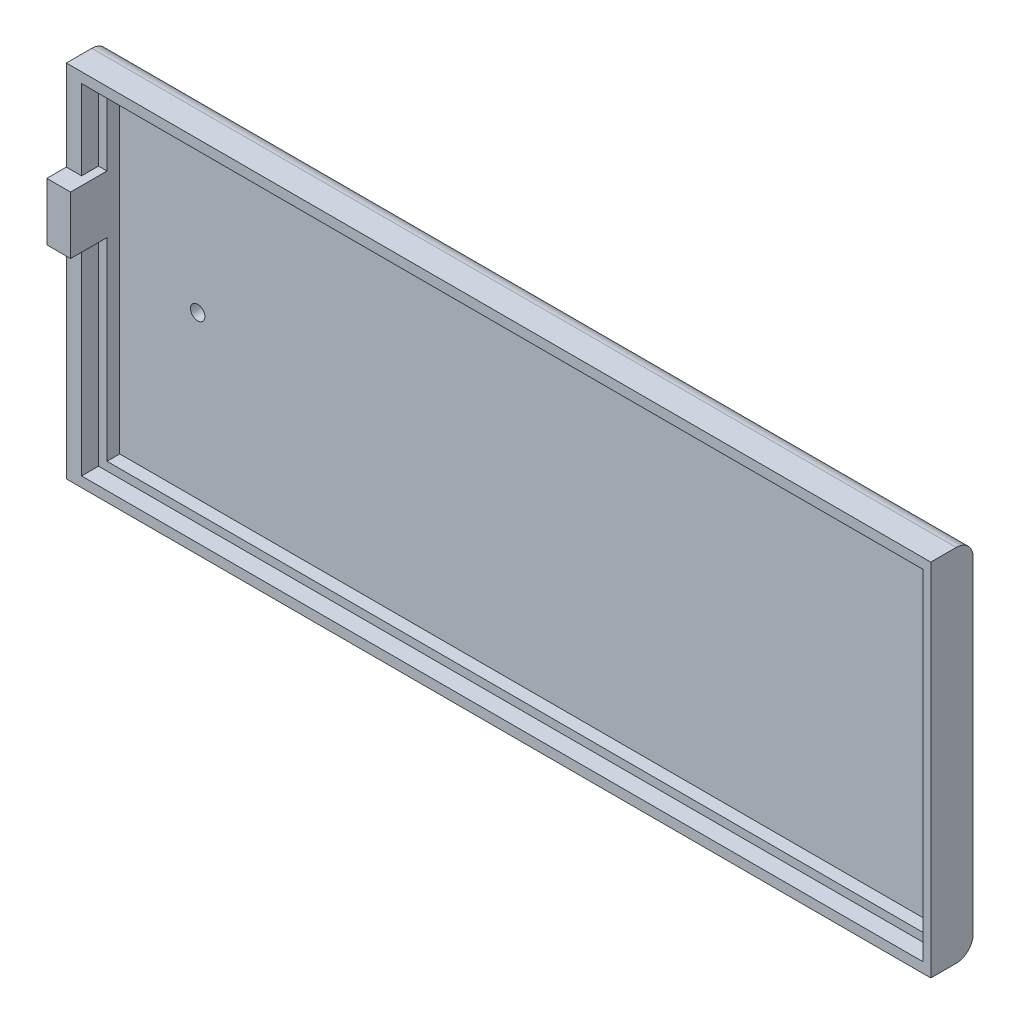
ISO-10303-21;
HEADER;
FILE_DESCRIPTION(('STEP AP214'),'2;1');
FILE_NAME('part.step','',(''),(''),'','','');
FILE_SCHEMA(('AUTOMOTIVE_DESIGN { 1 0 10303 214 1 1 1 1 }'));
ENDSEC;
DATA;
#1=APPLICATION_CONTEXT('core data for automotive mechanical design processes');
#2=APPLICATION_PROTOCOL_DEFINITION('international standard','automotive_design',2000,#1);
#3=PRODUCT_CONTEXT('',#1,'mechanical');
#4=PRODUCT('Part','Part','',(#3));
#5=PRODUCT_RELATED_PRODUCT_CATEGORY('part','',(#4));
#6=PRODUCT_DEFINITION_FORMATION('','',#4);
#7=PRODUCT_DEFINITION_CONTEXT('part definition',#1,'design');
#8=PRODUCT_DEFINITION('design','',#6,#7);
#9=PRODUCT_DEFINITION_SHAPE('','',#8);
#10=(LENGTH_UNIT() NAMED_UNIT(*) SI_UNIT(.MILLI.,.METRE.));
#11=(NAMED_UNIT(*) PLANE_ANGLE_UNIT() SI_UNIT($,.RADIAN.));
#12=(NAMED_UNIT(*) SI_UNIT($,.STERADIAN.) SOLID_ANGLE_UNIT());
#13=UNCERTAINTY_MEASURE_WITH_UNIT(LENGTH_MEASURE(1.E-05),#10,'distance_accuracy_value','');
#14=(GEOMETRIC_REPRESENTATION_CONTEXT(3) GLOBAL_UNCERTAINTY_ASSIGNED_CONTEXT((#13)) GLOBAL_UNIT_ASSIGNED_CONTEXT((#10,
#11,#12)) REPRESENTATION_CONTEXT('',''));
#15=CARTESIAN_POINT('',(0.,0.,0.));
#16=DIRECTION('',(0.,0.,1.));
#17=DIRECTION('',(1.,0.,0.));
#18=AXIS2_PLACEMENT_3D('',#15,#16,#17);
#19=CARTESIAN_POINT('',(0.,0.,5.));
#20=DIRECTION('',(0.,0.,-1.));
#21=DIRECTION('',(-1.,0.,0.));
#22=AXIS2_PLACEMENT_3D('',#19,#20,#21);
#23=PLANE('',#22);
#24=DIRECTION('',(-1.,0.,0.));
#25=VECTOR('',#24,1.);
#26=CARTESIAN_POINT('',(0.,31.8635072,5.));
#27=LINE('',#26,#25);
#28=CARTESIAN_POINT('',(1.8,31.8635072,5.));
#29=VERTEX_POINT('',#28);
#30=CARTESIAN_POINT('',(0.,31.8635072,5.));
#31=VERTEX_POINT('',#30);
#32=EDGE_CURVE('E424',#29,#31,#27,.T.);
#33=ORIENTED_EDGE('',*,*,#32,.F.);
#34=DIRECTION('',(0.,-1.,0.));
#35=VECTOR('',#34,1.);
#36=CARTESIAN_POINT('',(1.8,31.8635072,5.));
#37=LINE('',#36,#35);
#38=CARTESIAN_POINT('',(1.8,41.3,5.));
#39=VERTEX_POINT('',#38);
#40=EDGE_CURVE('E197',#39,#29,#37,.T.);
#41=ORIENTED_EDGE('',*,*,#40,.F.);
#42=DIRECTION('',(-1.,0.,0.));
#43=VECTOR('',#42,1.);
#44=CARTESIAN_POINT('',(1.8,41.3,5.));
#45=LINE('',#44,#43);
#46=CARTESIAN_POINT('',(101.1,41.3,5.));
#47=VERTEX_POINT('',#46);
#48=EDGE_CURVE('E397',#47,#39,#45,.T.);
#49=ORIENTED_EDGE('',*,*,#48,.F.);
#50=DIRECTION('',(0.,1.,0.));
#51=VECTOR('',#50,1.);
#52=CARTESIAN_POINT('',(101.1,41.3,5.));
#53=LINE('',#52,#51);
#54=CARTESIAN_POINT('',(101.1,1.2,5.));
#55=VERTEX_POINT('',#54);
#56=EDGE_CURVE('E393',#55,#47,#53,.T.);
#57=ORIENTED_EDGE('',*,*,#56,.F.);
#58=DIRECTION('',(1.,0.,0.));
#59=VECTOR('',#58,1.);
#60=CARTESIAN_POINT('',(101.1,1.2,5.));
#61=LINE('',#60,#59);
#62=CARTESIAN_POINT('',(1.80000000000001,1.19999999999999,5.));
#63=VERTEX_POINT('',#62);
#64=EDGE_CURVE('E388',#63,#55,#61,.T.);
#65=ORIENTED_EDGE('',*,*,#64,.F.);
#66=DIRECTION('',(0.,-1.,0.));
#67=VECTOR('',#66,1.);
#68=CARTESIAN_POINT('',(1.80000000000001,1.19999999999999,5.));
#69=LINE('',#68,#67);
#70=CARTESIAN_POINT('',(1.8,25.0635072,5.));
#71=VERTEX_POINT('',#70);
#72=EDGE_CURVE('E384',#71,#63,#69,.T.);
#73=ORIENTED_EDGE('',*,*,#72,.F.);
#74=DIRECTION('',(1.,0.,0.));
#75=VECTOR('',#74,1.);
#76=CARTESIAN_POINT('',(0.,25.0635072,5.));
#77=LINE('',#76,#75);
#78=CARTESIAN_POINT('',(0.,25.0635072,5.));
#79=VERTEX_POINT('',#78);
#80=EDGE_CURVE('E311',#79,#71,#77,.T.);
#81=ORIENTED_EDGE('',*,*,#80,.F.);
#82=DIRECTION('',(0.,-1.,0.));
#83=VECTOR('',#82,1.);
#84=CARTESIAN_POINT('',(0.,0.,5.));
#85=LINE('',#84,#83);
#86=CARTESIAN_POINT('',(0.,0.,5.));
#87=VERTEX_POINT('',#86);
#88=EDGE_CURVE('E238',#79,#87,#85,.T.);
#89=ORIENTED_EDGE('',*,*,#88,.T.);
#90=DIRECTION('',(1.,0.,0.));
#91=VECTOR('',#90,1.);
#92=CARTESIAN_POINT('',(0.,0.,5.));
#93=LINE('',#92,#91);
#94=CARTESIAN_POINT('',(102.,0.,5.));
#95=VERTEX_POINT('',#94);
#96=EDGE_CURVE('E237',#87,#95,#93,.T.);
#97=ORIENTED_EDGE('',*,*,#96,.T.);
#98=DIRECTION('',(0.,1.,0.));
#99=VECTOR('',#98,1.);
#100=CARTESIAN_POINT('',(102.,0.,5.));
#101=LINE('',#100,#99);
#102=CARTESIAN_POINT('',(102.,42.5,5.));
#103=VERTEX_POINT('',#102);
#104=EDGE_CURVE('E241',#95,#103,#101,.T.);
#105=ORIENTED_EDGE('',*,*,#104,.T.);
#106=DIRECTION('',(-1.,0.,0.));
#107=VECTOR('',#106,1.);
#108=CARTESIAN_POINT('',(0.,42.5,5.));
#109=LINE('',#108,#107);
#110=CARTESIAN_POINT('',(0.,42.5,5.));
#111=VERTEX_POINT('',#110);
#112=EDGE_CURVE('E244',#103,#111,#109,.T.);
#113=ORIENTED_EDGE('',*,*,#112,.T.);
#114=EDGE_CURVE('E233',#111,#31,#85,.T.);
#115=ORIENTED_EDGE('',*,*,#114,.T.);
#116=EDGE_LOOP('',(#33,#41,#49,#57,#65,#73,#81,#89,#97,#105,#113,#115));
#117=FACE_BOUND('',#116,.T.);
#118=ADVANCED_FACE('F45',(#117),#23,.F.);
#119=CARTESIAN_POINT('',(0.,0.,5.));
#120=DIRECTION('',(1.,0.,0.));
#121=DIRECTION('',(0.,0.,-1.));
#122=AXIS2_PLACEMENT_3D('',#119,#120,#121);
#123=PLANE('',#122);
#124=DIRECTION('',(0.,-1.,0.));
#125=VECTOR('',#124,1.);
#126=CARTESIAN_POINT('',(0.,0.,0.));
#127=LINE('',#126,#125);
#128=CARTESIAN_POINT('',(0.,40.5,0.));
#129=VERTEX_POINT('',#128);
#130=CARTESIAN_POINT('',(0.,2.,0.));
#131=VERTEX_POINT('',#130);
#132=EDGE_CURVE('E214',#129,#131,#127,.T.);
#133=ORIENTED_EDGE('',*,*,#132,.T.);
#134=CARTESIAN_POINT('',(0.,2.,2.));
#135=DIRECTION('',(1.,0.,0.));
#136=DIRECTION('',(0.,0.,-1.));
#137=AXIS2_PLACEMENT_3D('',#134,#135,#136);
#138=CIRCLE('',#137,2.);
#139=CARTESIAN_POINT('',(0.,0.,2.));
#140=VERTEX_POINT('',#139);
#141=EDGE_CURVE('E54',#131,#140,#138,.F.);
#142=ORIENTED_EDGE('',*,*,#141,.T.);
#143=DIRECTION('',(0.,0.,-1.));
#144=VECTOR('',#143,1.);
#145=CARTESIAN_POINT('',(0.,0.,5.));
#146=LINE('',#145,#144);
#147=EDGE_CURVE('E262',#87,#140,#146,.T.);
#148=ORIENTED_EDGE('',*,*,#147,.F.);
#149=ORIENTED_EDGE('',*,*,#88,.F.);
#150=DIRECTION('',(0.,0.,-1.));
#151=VECTOR('',#150,1.);
#152=CARTESIAN_POINT('',(0.,25.0635072,7.3));
#153=LINE('',#152,#151);
#154=CARTESIAN_POINT('',(0.,25.0635072,7.3));
#155=VERTEX_POINT('',#154);
#156=EDGE_CURVE('E316',#155,#79,#153,.T.);
#157=ORIENTED_EDGE('',*,*,#156,.F.);
#158=DIRECTION('',(0.,-1.,0.));
#159=VECTOR('',#158,1.);
#160=CARTESIAN_POINT('',(0.,31.8635072,7.3));
#161=LINE('',#160,#159);
#162=CARTESIAN_POINT('',(0.,31.8635072,7.3));
#163=VERTEX_POINT('',#162);
#164=EDGE_CURVE('E421',#163,#155,#161,.T.);
#165=ORIENTED_EDGE('',*,*,#164,.F.);
#166=DIRECTION('',(0.,0.,-1.));
#167=VECTOR('',#166,1.);
#168=CARTESIAN_POINT('',(0.,31.8635072,7.3));
#169=LINE('',#168,#167);
#170=EDGE_CURVE('E433',#163,#31,#169,.T.);
#171=ORIENTED_EDGE('',*,*,#170,.T.);
#172=ORIENTED_EDGE('',*,*,#114,.F.);
#173=DIRECTION('',(0.,0.,-1.));
#174=VECTOR('',#173,1.);
#175=CARTESIAN_POINT('',(0.,42.5,5.));
#176=LINE('',#175,#174);
#177=CARTESIAN_POINT('',(0.,42.5,2.));
#178=VERTEX_POINT('',#177);
#179=EDGE_CURVE('E246',#111,#178,#176,.T.);
#180=ORIENTED_EDGE('',*,*,#179,.T.);
#181=CARTESIAN_POINT('',(0.,40.5,2.));
#182=DIRECTION('',(1.,0.,0.));
#183=DIRECTION('',(0.,0.,-1.));
#184=AXIS2_PLACEMENT_3D('',#181,#182,#183);
#185=CIRCLE('',#184,2.);
#186=EDGE_CURVE('E61',#178,#129,#185,.F.);
#187=ORIENTED_EDGE('',*,*,#186,.T.);
#188=EDGE_LOOP('',(#133,#142,#148,#149,#157,#165,#171,#172,#180,#187));
#189=FACE_BOUND('',#188,.T.);
#190=ADVANCED_FACE('F286',(#189),#123,.F.);
#191=CARTESIAN_POINT('',(0.,0.,5.));
#192=DIRECTION('',(0.,1.,0.));
#193=DIRECTION('',(0.,0.,1.));
#194=AXIS2_PLACEMENT_3D('',#191,#192,#193);
#195=PLANE('',#194);
#196=ORIENTED_EDGE('',*,*,#147,.T.);
#197=DIRECTION('',(1.,0.,0.));
#198=VECTOR('',#197,1.);
#199=CARTESIAN_POINT('',(102.,0.,2.));
#200=LINE('',#199,#198);
#201=CARTESIAN_POINT('',(102.,0.,2.));
#202=VERTEX_POINT('',#201);
#203=EDGE_CURVE('E266',#140,#202,#200,.T.);
#204=ORIENTED_EDGE('',*,*,#203,.T.);
#205=DIRECTION('',(0.,0.,-1.));
#206=VECTOR('',#205,1.);
#207=CARTESIAN_POINT('',(102.,0.,5.));
#208=LINE('',#207,#206);
#209=EDGE_CURVE('E258',#95,#202,#208,.T.);
#210=ORIENTED_EDGE('',*,*,#209,.F.);
#211=ORIENTED_EDGE('',*,*,#96,.F.);
#212=EDGE_LOOP('',(#196,#204,#210,#211));
#213=FACE_BOUND('',#212,.T.);
#214=ADVANCED_FACE('F292',(#213),#195,.F.);
#215=CARTESIAN_POINT('',(102.,0.,5.));
#216=DIRECTION('',(-1.,0.,0.));
#217=DIRECTION('',(0.,0.,1.));
#218=AXIS2_PLACEMENT_3D('',#215,#216,#217);
#219=PLANE('',#218);
#220=ORIENTED_EDGE('',*,*,#209,.T.);
#221=CARTESIAN_POINT('',(102.,2.,2.));
#222=DIRECTION('',(-1.,0.,0.));
#223=DIRECTION('',(0.,0.,1.));
#224=AXIS2_PLACEMENT_3D('',#221,#222,#223);
#225=CIRCLE('',#224,2.);
#226=CARTESIAN_POINT('',(102.,2.,0.));
#227=VERTEX_POINT('',#226);
#228=EDGE_CURVE('E273',#202,#227,#225,.F.);
#229=ORIENTED_EDGE('',*,*,#228,.T.);
#230=DIRECTION('',(0.,1.,0.));
#231=VECTOR('',#230,1.);
#232=CARTESIAN_POINT('',(102.,0.,0.));
#233=LINE('',#232,#231);
#234=CARTESIAN_POINT('',(102.,40.5,0.));
#235=VERTEX_POINT('',#234);
#236=EDGE_CURVE('E218',#227,#235,#233,.T.);
#237=ORIENTED_EDGE('',*,*,#236,.T.);
#238=CARTESIAN_POINT('',(102.,40.5,2.));
#239=DIRECTION('',(-1.,0.,0.));
#240=DIRECTION('',(0.,0.,1.));
#241=AXIS2_PLACEMENT_3D('',#238,#239,#240);
#242=CIRCLE('',#241,2.);
#243=CARTESIAN_POINT('',(102.,42.5,2.));
#244=VERTEX_POINT('',#243);
#245=EDGE_CURVE('E270',#235,#244,#242,.F.);
#246=ORIENTED_EDGE('',*,*,#245,.T.);
#247=DIRECTION('',(0.,0.,-1.));
#248=VECTOR('',#247,1.);
#249=CARTESIAN_POINT('',(102.,42.5,5.));
#250=LINE('',#249,#248);
#251=EDGE_CURVE('E254',#103,#244,#250,.T.);
#252=ORIENTED_EDGE('',*,*,#251,.F.);
#253=ORIENTED_EDGE('',*,*,#104,.F.);
#254=EDGE_LOOP('',(#220,#229,#237,#246,#252,#253));
#255=FACE_BOUND('',#254,.T.);
#256=ADVANCED_FACE('F296',(#255),#219,.F.);
#257=CARTESIAN_POINT('',(0.,42.5,5.));
#258=DIRECTION('',(0.,-1.,0.));
#259=DIRECTION('',(0.,0.,-1.));
#260=AXIS2_PLACEMENT_3D('',#257,#258,#259);
#261=PLANE('',#260);
#262=ORIENTED_EDGE('',*,*,#251,.T.);
#263=DIRECTION('',(-1.,0.,0.));
#264=VECTOR('',#263,1.);
#265=CARTESIAN_POINT('',(0.,42.5,2.));
#266=LINE('',#265,#264);
#267=EDGE_CURVE('E11',#244,#178,#266,.T.);
#268=ORIENTED_EDGE('',*,*,#267,.T.);
#269=ORIENTED_EDGE('',*,*,#179,.F.);
#270=ORIENTED_EDGE('',*,*,#112,.F.);
#271=EDGE_LOOP('',(#262,#268,#269,#270));
#272=FACE_BOUND('',#271,.T.);
#273=ADVANCED_FACE('F303',(#272),#261,.F.);
#274=CARTESIAN_POINT('',(0.,0.,0.));
#275=DIRECTION('',(0.,0.,-1.));
#276=DIRECTION('',(-1.,0.,0.));
#277=AXIS2_PLACEMENT_3D('',#274,#275,#276);
#278=PLANE('',#277);
#279=CARTESIAN_POINT('',(12.,21.25,0.));
#280=DIRECTION('',(0.,0.,-1.));
#281=DIRECTION('',(-1.,0.,0.));
#282=AXIS2_PLACEMENT_3D('',#279,#280,#281);
#283=CIRCLE('',#282,0.85);
#284=CARTESIAN_POINT('',(11.15,21.25,0.));
#285=VERTEX_POINT('',#284);
#286=EDGE_CURVE('E389',#285,#285,#283,.T.);
#287=ORIENTED_EDGE('',*,*,#286,.F.);
#288=EDGE_LOOP('',(#287));
#289=FACE_BOUND('',#288,.T.);
#290=ORIENTED_EDGE('',*,*,#236,.F.);
#291=DIRECTION('',(1.,0.,0.));
#292=VECTOR('',#291,1.);
#293=CARTESIAN_POINT('',(0.,2.,0.));
#294=LINE('',#293,#292);
#295=EDGE_CURVE('E68',#227,#131,#294,.F.);
#296=ORIENTED_EDGE('',*,*,#295,.T.);
#297=ORIENTED_EDGE('',*,*,#132,.F.);
#298=DIRECTION('',(-1.,0.,0.));
#299=VECTOR('',#298,1.);
#300=CARTESIAN_POINT('',(102.,40.5,0.));
#301=LINE('',#300,#299);
#302=EDGE_CURVE('E276',#129,#235,#301,.F.);
#303=ORIENTED_EDGE('',*,*,#302,.T.);
#304=EDGE_LOOP('',(#290,#296,#297,#303));
#305=FACE_BOUND('',#304,.T.);
#306=ADVANCED_FACE('F299',(#289,#305),#278,.T.);
#307=CARTESIAN_POINT('',(2.8,40.3,1.5));
#308=DIRECTION('',(-1.,0.,0.));
#309=DIRECTION('',(0.,-1.,0.));
#310=AXIS2_PLACEMENT_3D('',#307,#308,#309);
#311=PLANE('',#310);
#312=DIRECTION('',(0.,1.,0.));
#313=VECTOR('',#312,1.);
#314=CARTESIAN_POINT('',(2.8,40.3,3.));
#315=LINE('',#314,#313);
#316=CARTESIAN_POINT('',(2.8,31.8635072,3.));
#317=VERTEX_POINT('',#316);
#318=CARTESIAN_POINT('',(2.8,40.3,3.));
#319=VERTEX_POINT('',#318);
#320=EDGE_CURVE('E185',#317,#319,#315,.T.);
#321=ORIENTED_EDGE('',*,*,#320,.F.);
#322=DIRECTION('',(0.,0.,-1.));
#323=VECTOR('',#322,1.);
#324=CARTESIAN_POINT('',(2.8,31.8635072,7.3));
#325=LINE('',#324,#323);
#326=CARTESIAN_POINT('',(2.8,31.8635072,7.3));
#327=VERTEX_POINT('',#326);
#328=EDGE_CURVE('E329',#327,#317,#325,.T.);
#329=ORIENTED_EDGE('',*,*,#328,.F.);
#330=DIRECTION('',(0.,1.,0.));
#331=VECTOR('',#330,1.);
#332=CARTESIAN_POINT('',(2.8,31.8635072,7.3));
#333=LINE('',#332,#331);
#334=CARTESIAN_POINT('',(2.8,25.0635072,7.3));
#335=VERTEX_POINT('',#334);
#336=EDGE_CURVE('E427',#335,#327,#333,.T.);
#337=ORIENTED_EDGE('',*,*,#336,.F.);
#338=DIRECTION('',(0.,0.,-1.));
#339=VECTOR('',#338,1.);
#340=CARTESIAN_POINT('',(2.8,25.0635072,7.3));
#341=LINE('',#340,#339);
#342=CARTESIAN_POINT('',(2.8,25.0635072,3.));
#343=VERTEX_POINT('',#342);
#344=EDGE_CURVE('E323',#335,#343,#341,.T.);
#345=ORIENTED_EDGE('',*,*,#344,.T.);
#346=DIRECTION('',(0.,1.,0.));
#347=VECTOR('',#346,1.);
#348=CARTESIAN_POINT('',(2.8,25.0635072,3.));
#349=LINE('',#348,#347);
#350=CARTESIAN_POINT('',(2.80000000000001,2.2,3.));
#351=VERTEX_POINT('',#350);
#352=EDGE_CURVE('E352',#351,#343,#349,.T.);
#353=ORIENTED_EDGE('',*,*,#352,.F.);
#354=DIRECTION('',(0.,0.,1.));
#355=VECTOR('',#354,1.);
#356=CARTESIAN_POINT('',(2.80000000000001,2.2,1.5));
#357=LINE('',#356,#355);
#358=CARTESIAN_POINT('',(2.80000000000001,2.2,1.5));
#359=VERTEX_POINT('',#358);
#360=EDGE_CURVE('E229',#359,#351,#357,.T.);
#361=ORIENTED_EDGE('',*,*,#360,.F.);
#362=DIRECTION('',(0.,-1.,0.));
#363=VECTOR('',#362,1.);
#364=CARTESIAN_POINT('',(2.8,40.3,1.5));
#365=LINE('',#364,#363);
#366=CARTESIAN_POINT('',(2.8,40.3,1.5));
#367=VERTEX_POINT('',#366);
#368=EDGE_CURVE('E211',#367,#359,#365,.T.);
#369=ORIENTED_EDGE('',*,*,#368,.F.);
#370=DIRECTION('',(0.,0.,1.));
#371=VECTOR('',#370,1.);
#372=CARTESIAN_POINT('',(2.8,40.3,1.5));
#373=LINE('',#372,#371);
#374=EDGE_CURVE('E203',#367,#319,#373,.T.);
#375=ORIENTED_EDGE('',*,*,#374,.T.);
#376=EDGE_LOOP('',(#321,#329,#337,#345,#353,#361,#369,#375));
#377=FACE_BOUND('',#376,.T.);
#378=ADVANCED_FACE('F209',(#377),#311,.F.);
#379=CARTESIAN_POINT('',(2.8,40.3,1.5));
#380=DIRECTION('',(0.,1.,0.));
#381=DIRECTION('',(0.,0.,1.));
#382=AXIS2_PLACEMENT_3D('',#379,#380,#381);
#383=PLANE('',#382);
#384=DIRECTION('',(0.,0.,1.));
#385=VECTOR('',#384,1.);
#386=CARTESIAN_POINT('',(100.1,40.3,1.5));
#387=LINE('',#386,#385);
#388=CARTESIAN_POINT('',(100.1,40.3,1.5));
#389=VERTEX_POINT('',#388);
#390=CARTESIAN_POINT('',(100.1,40.3,3.));
#391=VERTEX_POINT('',#390);
#392=EDGE_CURVE('E205',#389,#391,#387,.T.);
#393=ORIENTED_EDGE('',*,*,#392,.T.);
#394=DIRECTION('',(1.,0.,0.));
#395=VECTOR('',#394,1.);
#396=CARTESIAN_POINT('',(100.1,40.3,3.));
#397=LINE('',#396,#395);
#398=EDGE_CURVE('E188',#319,#391,#397,.T.);
#399=ORIENTED_EDGE('',*,*,#398,.F.);
#400=ORIENTED_EDGE('',*,*,#374,.F.);
#401=DIRECTION('',(-1.,0.,0.));
#402=VECTOR('',#401,1.);
#403=CARTESIAN_POINT('',(2.8,40.3,1.5));
#404=LINE('',#403,#402);
#405=EDGE_CURVE('E223',#389,#367,#404,.T.);
#406=ORIENTED_EDGE('',*,*,#405,.F.);
#407=EDGE_LOOP('',(#393,#399,#400,#406));
#408=FACE_BOUND('',#407,.T.);
#409=ADVANCED_FACE('F201',(#408),#383,.F.);
#410=CARTESIAN_POINT('',(100.1,40.3,1.5));
#411=DIRECTION('',(1.,0.,0.));
#412=DIRECTION('',(0.,0.,-1.));
#413=AXIS2_PLACEMENT_3D('',#410,#411,#412);
#414=PLANE('',#413);
#415=DIRECTION('',(0.,0.,1.));
#416=VECTOR('',#415,1.);
#417=CARTESIAN_POINT('',(100.1,2.2,1.5));
#418=LINE('',#417,#416);
#419=CARTESIAN_POINT('',(100.1,2.2,1.5));
#420=VERTEX_POINT('',#419);
#421=CARTESIAN_POINT('',(100.1,2.2,3.));
#422=VERTEX_POINT('',#421);
#423=EDGE_CURVE('E220',#420,#422,#418,.T.);
#424=ORIENTED_EDGE('',*,*,#423,.T.);
#425=DIRECTION('',(0.,-1.,0.));
#426=VECTOR('',#425,1.);
#427=CARTESIAN_POINT('',(100.1,2.2,3.));
#428=LINE('',#427,#426);
#429=EDGE_CURVE('E207',#391,#422,#428,.T.);
#430=ORIENTED_EDGE('',*,*,#429,.F.);
#431=ORIENTED_EDGE('',*,*,#392,.F.);
#432=DIRECTION('',(0.,1.,0.));
#433=VECTOR('',#432,1.);
#434=CARTESIAN_POINT('',(100.1,40.3,1.5));
#435=LINE('',#434,#433);
#436=EDGE_CURVE('E335',#420,#389,#435,.T.);
#437=ORIENTED_EDGE('',*,*,#436,.F.);
#438=EDGE_LOOP('',(#424,#430,#431,#437));
#439=FACE_BOUND('',#438,.T.);
#440=ADVANCED_FACE('F348',(#439),#414,.F.);
#441=CARTESIAN_POINT('',(2.80000000000001,2.2,1.5));
#442=DIRECTION('',(0.,-1.,0.));
#443=DIRECTION('',(0.,0.,-1.));
#444=AXIS2_PLACEMENT_3D('',#441,#442,#443);
#445=PLANE('',#444);
#446=ORIENTED_EDGE('',*,*,#360,.T.);
#447=DIRECTION('',(-1.,0.,0.));
#448=VECTOR('',#447,1.);
#449=CARTESIAN_POINT('',(2.80000000000001,2.2,3.));
#450=LINE('',#449,#448);
#451=EDGE_CURVE('E346',#422,#351,#450,.T.);
#452=ORIENTED_EDGE('',*,*,#451,.F.);
#453=ORIENTED_EDGE('',*,*,#423,.F.);
#454=DIRECTION('',(1.,0.,0.));
#455=VECTOR('',#454,1.);
#456=CARTESIAN_POINT('',(2.80000000000001,2.2,1.5));
#457=LINE('',#456,#455);
#458=EDGE_CURVE('E327',#359,#420,#457,.T.);
#459=ORIENTED_EDGE('',*,*,#458,.F.);
#460=EDGE_LOOP('',(#446,#452,#453,#459));
#461=FACE_BOUND('',#460,.T.);
#462=ADVANCED_FACE('F344',(#461),#445,.F.);
#463=CARTESIAN_POINT('',(0.,0.,1.5));
#464=DIRECTION('',(0.,0.,1.));
#465=DIRECTION('',(1.,0.,0.));
#466=AXIS2_PLACEMENT_3D('',#463,#464,#465);
#467=PLANE('',#466);
#468=CARTESIAN_POINT('',(12.,21.25,1.5));
#469=DIRECTION('',(0.,0.,1.));
#470=DIRECTION('',(1.,0.,0.));
#471=AXIS2_PLACEMENT_3D('',#468,#469,#470);
#472=CIRCLE('',#471,0.85);
#473=CARTESIAN_POINT('',(12.85,21.25,1.5));
#474=VERTEX_POINT('',#473);
#475=EDGE_CURVE('E513',#474,#474,#472,.T.);
#476=ORIENTED_EDGE('',*,*,#475,.F.);
#477=EDGE_LOOP('',(#476));
#478=FACE_BOUND('',#477,.T.);
#479=ORIENTED_EDGE('',*,*,#368,.T.);
#480=ORIENTED_EDGE('',*,*,#458,.T.);
#481=ORIENTED_EDGE('',*,*,#436,.T.);
#482=ORIENTED_EDGE('',*,*,#405,.T.);
#483=EDGE_LOOP('',(#479,#480,#481,#482));
#484=FACE_BOUND('',#483,.T.);
#485=ADVANCED_FACE('F341',(#478,#484),#467,.T.);
#486=CARTESIAN_POINT('',(0.,25.0635072,7.3));
#487=DIRECTION('',(0.,1.,0.));
#488=DIRECTION('',(0.,0.,1.));
#489=AXIS2_PLACEMENT_3D('',#486,#487,#488);
#490=PLANE('',#489);
#491=ORIENTED_EDGE('',*,*,#80,.T.);
#492=DIRECTION('',(0.,0.,1.));
#493=VECTOR('',#492,1.);
#494=CARTESIAN_POINT('',(1.8,25.0635072,3.));
#495=LINE('',#494,#493);
#496=CARTESIAN_POINT('',(1.8,25.0635072,3.));
#497=VERTEX_POINT('',#496);
#498=EDGE_CURVE('E383',#497,#71,#495,.T.);
#499=ORIENTED_EDGE('',*,*,#498,.F.);
#500=DIRECTION('',(-1.,0.,0.));
#501=VECTOR('',#500,1.);
#502=CARTESIAN_POINT('',(1.8,25.0635072,3.));
#503=LINE('',#502,#501);
#504=EDGE_CURVE('E358',#343,#497,#503,.T.);
#505=ORIENTED_EDGE('',*,*,#504,.F.);
#506=ORIENTED_EDGE('',*,*,#344,.F.);
#507=DIRECTION('',(1.,0.,0.));
#508=VECTOR('',#507,1.);
#509=CARTESIAN_POINT('',(0.,25.0635072,7.3));
#510=LINE('',#509,#508);
#511=EDGE_CURVE('E320',#155,#335,#510,.T.);
#512=ORIENTED_EDGE('',*,*,#511,.F.);
#513=ORIENTED_EDGE('',*,*,#156,.T.);
#514=EDGE_LOOP('',(#491,#499,#505,#506,#512,#513));
#515=FACE_BOUND('',#514,.T.);
#516=ADVANCED_FACE('F318',(#515),#490,.F.);
#517=CARTESIAN_POINT('',(0.,31.8635072,7.3));
#518=DIRECTION('',(0.,-1.,0.));
#519=DIRECTION('',(0.,0.,-1.));
#520=AXIS2_PLACEMENT_3D('',#517,#518,#519);
#521=PLANE('',#520);
#522=ORIENTED_EDGE('',*,*,#328,.T.);
#523=DIRECTION('',(1.,0.,0.));
#524=VECTOR('',#523,1.);
#525=CARTESIAN_POINT('',(2.8,31.8635072,3.));
#526=LINE('',#525,#524);
#527=CARTESIAN_POINT('',(1.8,31.8635072,3.));
#528=VERTEX_POINT('',#527);
#529=EDGE_CURVE('E192',#528,#317,#526,.T.);
#530=ORIENTED_EDGE('',*,*,#529,.F.);
#531=DIRECTION('',(0.,0.,1.));
#532=VECTOR('',#531,1.);
#533=CARTESIAN_POINT('',(1.8,31.8635072,3.));
#534=LINE('',#533,#532);
#535=EDGE_CURVE('E403',#528,#29,#534,.T.);
#536=ORIENTED_EDGE('',*,*,#535,.T.);
#537=ORIENTED_EDGE('',*,*,#32,.T.);
#538=ORIENTED_EDGE('',*,*,#170,.F.);
#539=DIRECTION('',(-1.,0.,0.));
#540=VECTOR('',#539,1.);
#541=CARTESIAN_POINT('',(0.,31.8635072,7.3));
#542=LINE('',#541,#540);
#543=EDGE_CURVE('E430',#327,#163,#542,.T.);
#544=ORIENTED_EDGE('',*,*,#543,.F.);
#545=EDGE_LOOP('',(#522,#530,#536,#537,#538,#544));
#546=FACE_BOUND('',#545,.T.);
#547=ADVANCED_FACE('F442',(#546),#521,.F.);
#548=CARTESIAN_POINT('',(0.,0.,7.3));
#549=DIRECTION('',(0.,0.,1.));
#550=DIRECTION('',(1.,0.,0.));
#551=AXIS2_PLACEMENT_3D('',#548,#549,#550);
#552=PLANE('',#551);
#553=ORIENTED_EDGE('',*,*,#164,.T.);
#554=ORIENTED_EDGE('',*,*,#511,.T.);
#555=ORIENTED_EDGE('',*,*,#336,.T.);
#556=ORIENTED_EDGE('',*,*,#543,.T.);
#557=EDGE_LOOP('',(#553,#554,#555,#556));
#558=FACE_BOUND('',#557,.T.);
#559=ADVANCED_FACE('F448',(#558),#552,.T.);
#560=CARTESIAN_POINT('',(1.8,31.8635072,3.));
#561=DIRECTION('',(-1.,0.,0.));
#562=DIRECTION('',(0.,0.,1.));
#563=AXIS2_PLACEMENT_3D('',#560,#561,#562);
#564=PLANE('',#563);
#565=ORIENTED_EDGE('',*,*,#40,.T.);
#566=ORIENTED_EDGE('',*,*,#535,.F.);
#567=DIRECTION('',(0.,-1.,0.));
#568=VECTOR('',#567,1.);
#569=CARTESIAN_POINT('',(1.8,31.8635072,3.));
#570=LINE('',#569,#568);
#571=CARTESIAN_POINT('',(1.8,41.3,3.));
#572=VERTEX_POINT('',#571);
#573=EDGE_CURVE('E378',#572,#528,#570,.T.);
#574=ORIENTED_EDGE('',*,*,#573,.F.);
#575=DIRECTION('',(0.,0.,1.));
#576=VECTOR('',#575,1.);
#577=CARTESIAN_POINT('',(1.8,41.3,3.));
#578=LINE('',#577,#576);
#579=EDGE_CURVE('E407',#572,#39,#578,.T.);
#580=ORIENTED_EDGE('',*,*,#579,.T.);
#581=EDGE_LOOP('',(#565,#566,#574,#580));
#582=FACE_BOUND('',#581,.T.);
#583=ADVANCED_FACE('F467',(#582),#564,.F.);
#584=CARTESIAN_POINT('',(1.8,41.3,3.));
#585=DIRECTION('',(0.,1.,0.));
#586=DIRECTION('',(0.,0.,1.));
#587=AXIS2_PLACEMENT_3D('',#584,#585,#586);
#588=PLANE('',#587);
#589=ORIENTED_EDGE('',*,*,#48,.T.);
#590=ORIENTED_EDGE('',*,*,#579,.F.);
#591=DIRECTION('',(-1.,0.,0.));
#592=VECTOR('',#591,1.);
#593=CARTESIAN_POINT('',(1.8,41.3,3.));
#594=LINE('',#593,#592);
#595=CARTESIAN_POINT('',(101.1,41.3,3.));
#596=VERTEX_POINT('',#595);
#597=EDGE_CURVE('E374',#596,#572,#594,.T.);
#598=ORIENTED_EDGE('',*,*,#597,.F.);
#599=DIRECTION('',(0.,0.,1.));
#600=VECTOR('',#599,1.);
#601=CARTESIAN_POINT('',(101.1,41.3,3.));
#602=LINE('',#601,#600);
#603=EDGE_CURVE('E410',#596,#47,#602,.T.);
#604=ORIENTED_EDGE('',*,*,#603,.T.);
#605=EDGE_LOOP('',(#589,#590,#598,#604));
#606=FACE_BOUND('',#605,.T.);
#607=ADVANCED_FACE('F463',(#606),#588,.F.);
#608=CARTESIAN_POINT('',(101.1,41.3,3.));
#609=DIRECTION('',(1.,0.,0.));
#610=DIRECTION('',(0.,0.,-1.));
#611=AXIS2_PLACEMENT_3D('',#608,#609,#610);
#612=PLANE('',#611);
#613=ORIENTED_EDGE('',*,*,#56,.T.);
#614=ORIENTED_EDGE('',*,*,#603,.F.);
#615=DIRECTION('',(0.,1.,0.));
#616=VECTOR('',#615,1.);
#617=CARTESIAN_POINT('',(101.1,41.3,3.));
#618=LINE('',#617,#616);
#619=CARTESIAN_POINT('',(101.1,1.2,3.));
#620=VERTEX_POINT('',#619);
#621=EDGE_CURVE('E370',#620,#596,#618,.T.);
#622=ORIENTED_EDGE('',*,*,#621,.F.);
#623=DIRECTION('',(0.,0.,1.));
#624=VECTOR('',#623,1.);
#625=CARTESIAN_POINT('',(101.1,1.2,3.));
#626=LINE('',#625,#624);
#627=EDGE_CURVE('E413',#620,#55,#626,.T.);
#628=ORIENTED_EDGE('',*,*,#627,.T.);
#629=EDGE_LOOP('',(#613,#614,#622,#628));
#630=FACE_BOUND('',#629,.T.);
#631=ADVANCED_FACE('F459',(#630),#612,.F.);
#632=CARTESIAN_POINT('',(101.1,1.2,3.));
#633=DIRECTION('',(0.,-1.,0.));
#634=DIRECTION('',(1.,0.,0.));
#635=AXIS2_PLACEMENT_3D('',#632,#633,#634);
#636=PLANE('',#635);
#637=ORIENTED_EDGE('',*,*,#64,.T.);
#638=ORIENTED_EDGE('',*,*,#627,.F.);
#639=DIRECTION('',(1.,0.,0.));
#640=VECTOR('',#639,1.);
#641=CARTESIAN_POINT('',(101.1,1.2,3.));
#642=LINE('',#641,#640);
#643=CARTESIAN_POINT('',(1.80000000000001,1.19999999999999,3.));
#644=VERTEX_POINT('',#643);
#645=EDGE_CURVE('E366',#644,#620,#642,.T.);
#646=ORIENTED_EDGE('',*,*,#645,.F.);
#647=DIRECTION('',(0.,0.,1.));
#648=VECTOR('',#647,1.);
#649=CARTESIAN_POINT('',(1.80000000000001,1.19999999999999,3.));
#650=LINE('',#649,#648);
#651=EDGE_CURVE('E416',#644,#63,#650,.T.);
#652=ORIENTED_EDGE('',*,*,#651,.T.);
#653=EDGE_LOOP('',(#637,#638,#646,#652));
#654=FACE_BOUND('',#653,.T.);
#655=ADVANCED_FACE('F455',(#654),#636,.F.);
#656=CARTESIAN_POINT('',(1.80000000000001,1.19999999999999,3.));
#657=DIRECTION('',(-1.,0.,0.));
#658=DIRECTION('',(0.,-1.,0.));
#659=AXIS2_PLACEMENT_3D('',#656,#657,#658);
#660=PLANE('',#659);
#661=ORIENTED_EDGE('',*,*,#72,.T.);
#662=ORIENTED_EDGE('',*,*,#651,.F.);
#663=DIRECTION('',(0.,-1.,0.));
#664=VECTOR('',#663,1.);
#665=CARTESIAN_POINT('',(1.80000000000001,1.19999999999999,3.));
#666=LINE('',#665,#664);
#667=EDGE_CURVE('E362',#497,#644,#666,.T.);
#668=ORIENTED_EDGE('',*,*,#667,.F.);
#669=ORIENTED_EDGE('',*,*,#498,.T.);
#670=EDGE_LOOP('',(#661,#662,#668,#669));
#671=FACE_BOUND('',#670,.T.);
#672=ADVANCED_FACE('F452',(#671),#660,.F.);
#673=CARTESIAN_POINT('',(0.,0.,3.));
#674=DIRECTION('',(0.,0.,-1.));
#675=DIRECTION('',(-1.,0.,0.));
#676=AXIS2_PLACEMENT_3D('',#673,#674,#675);
#677=PLANE('',#676);
#678=ORIENTED_EDGE('',*,*,#320,.T.);
#679=ORIENTED_EDGE('',*,*,#398,.T.);
#680=ORIENTED_EDGE('',*,*,#429,.T.);
#681=ORIENTED_EDGE('',*,*,#451,.T.);
#682=ORIENTED_EDGE('',*,*,#352,.T.);
#683=ORIENTED_EDGE('',*,*,#504,.T.);
#684=ORIENTED_EDGE('',*,*,#667,.T.);
#685=ORIENTED_EDGE('',*,*,#645,.T.);
#686=ORIENTED_EDGE('',*,*,#621,.T.);
#687=ORIENTED_EDGE('',*,*,#597,.T.);
#688=ORIENTED_EDGE('',*,*,#573,.T.);
#689=ORIENTED_EDGE('',*,*,#529,.T.);
#690=EDGE_LOOP('',(#678,#679,#680,#681,#682,#683,#684,#685,#686,#687,#688,#689));
#691=FACE_BOUND('',#690,.T.);
#692=ADVANCED_FACE('F187',(#691),#677,.F.);
#693=CARTESIAN_POINT('',(12.,21.25,-29.5));
#694=DIRECTION('',(0.,0.,1.));
#695=DIRECTION('',(1.,0.,0.));
#696=AXIS2_PLACEMENT_3D('',#693,#694,#695);
#697=CYLINDRICAL_SURFACE('',#696,0.85);
#698=ORIENTED_EDGE('',*,*,#286,.T.);
#699=EDGE_LOOP('',(#698));
#700=FACE_BOUND('',#699,.T.);
#701=ORIENTED_EDGE('',*,*,#475,.T.);
#702=EDGE_LOOP('',(#701));
#703=FACE_BOUND('',#702,.T.);
#704=ADVANCED_FACE('F497',(#700,#703),#697,.F.);
#705=CARTESIAN_POINT('',(0.,2.,2.));
#706=DIRECTION('',(-1.,0.,0.));
#707=DIRECTION('',(0.,0.,1.));
#708=AXIS2_PLACEMENT_3D('',#705,#706,#707);
#709=CYLINDRICAL_SURFACE('',#708,2.);
#710=ORIENTED_EDGE('',*,*,#141,.F.);
#711=ORIENTED_EDGE('',*,*,#295,.F.);
#712=ORIENTED_EDGE('',*,*,#228,.F.);
#713=ORIENTED_EDGE('',*,*,#203,.F.);
#714=EDGE_LOOP('',(#710,#711,#712,#713));
#715=FACE_BOUND('',#714,.T.);
#716=ADVANCED_FACE('F294',(#715),#709,.T.);
#717=CARTESIAN_POINT('',(0.,40.5,2.));
#718=DIRECTION('',(1.,0.,0.));
#719=DIRECTION('',(0.,0.,-1.));
#720=AXIS2_PLACEMENT_3D('',#717,#718,#719);
#721=CYLINDRICAL_SURFACE('',#720,2.);
#722=ORIENTED_EDGE('',*,*,#245,.F.);
#723=ORIENTED_EDGE('',*,*,#302,.F.);
#724=ORIENTED_EDGE('',*,*,#186,.F.);
#725=ORIENTED_EDGE('',*,*,#267,.F.);
#726=EDGE_LOOP('',(#722,#723,#724,#725));
#727=FACE_BOUND('',#726,.T.);
#728=ADVANCED_FACE('F47',(#727),#721,.T.);
#729=CLOSED_SHELL('',(#118,#190,#214,#256,#273,#306,#378,#409,#440,#462,#485,#516,#547,#559,
#583,#607,#631,#655,#672,#692,#704,#716,#728));
#730=MANIFOLD_SOLID_BREP('B2',#729);
#731=ADVANCED_BREP_SHAPE_REPRESENTATION('',(#18,#730),#14);
#732=SHAPE_DEFINITION_REPRESENTATION(#9,#731);
ENDSEC;
END-ISO-10303-21;
